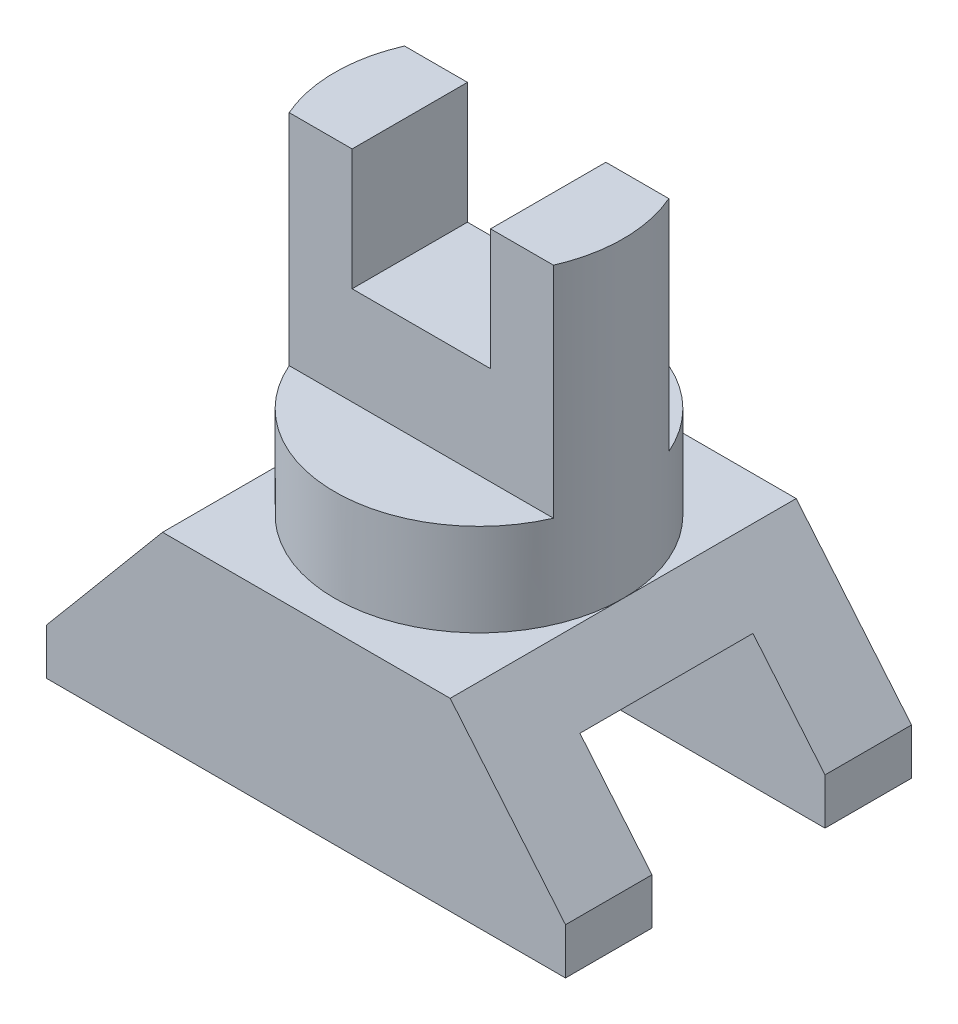
ISO-10303-21;
HEADER;
FILE_DESCRIPTION(('STEP AP214'),'2;1');
FILE_NAME('part.step','',(''),(''),'','','');
FILE_SCHEMA(('AUTOMOTIVE_DESIGN { 1 0 10303 214 1 1 1 1 }'));
ENDSEC;
DATA;
#1=APPLICATION_CONTEXT('core data for automotive mechanical design processes');
#2=APPLICATION_PROTOCOL_DEFINITION('international standard','automotive_design',2000,#1);
#3=PRODUCT_CONTEXT('',#1,'mechanical');
#4=PRODUCT('Part','Part','',(#3));
#5=PRODUCT_RELATED_PRODUCT_CATEGORY('part','',(#4));
#6=PRODUCT_DEFINITION_FORMATION('','',#4);
#7=PRODUCT_DEFINITION_CONTEXT('part definition',#1,'design');
#8=PRODUCT_DEFINITION('design','',#6,#7);
#9=PRODUCT_DEFINITION_SHAPE('','',#8);
#10=(LENGTH_UNIT() NAMED_UNIT(*) SI_UNIT(.MILLI.,.METRE.));
#11=(NAMED_UNIT(*) PLANE_ANGLE_UNIT() SI_UNIT($,.RADIAN.));
#12=(NAMED_UNIT(*) SI_UNIT($,.STERADIAN.) SOLID_ANGLE_UNIT());
#13=UNCERTAINTY_MEASURE_WITH_UNIT(LENGTH_MEASURE(1.E-05),#10,'distance_accuracy_value','');
#14=(GEOMETRIC_REPRESENTATION_CONTEXT(3) GLOBAL_UNCERTAINTY_ASSIGNED_CONTEXT((#13)) GLOBAL_UNIT_ASSIGNED_CONTEXT((#10,
#11,#12)) REPRESENTATION_CONTEXT('',''));
#15=CARTESIAN_POINT('',(0.,0.,0.));
#16=DIRECTION('',(0.,0.,1.));
#17=DIRECTION('',(1.,0.,0.));
#18=AXIS2_PLACEMENT_3D('',#15,#16,#17);
#19=CARTESIAN_POINT('',(0.,0.,0.));
#20=DIRECTION('',(0.,-1.,0.));
#21=DIRECTION('',(0.,0.,-1.));
#22=AXIS2_PLACEMENT_3D('',#19,#20,#21);
#23=PLANE('',#22);
#24=DIRECTION('',(-1.,0.,0.));
#25=VECTOR('',#24,1.);
#26=CARTESIAN_POINT('',(13.6567838997883,0.,22.4457295521094));
#27=LINE('',#26,#25);
#28=CARTESIAN_POINT('',(-6.34321610021173,0.,22.4457295521094));
#29=VERTEX_POINT('',#28);
#30=CARTESIAN_POINT('',(-56.2145518363941,0.,22.4457295521094));
#31=VERTEX_POINT('',#30);
#32=EDGE_CURVE('E182',#29,#31,#27,.T.);
#33=ORIENTED_EDGE('',*,*,#32,.F.);
#34=DIRECTION('',(0.,0.,1.));
#35=VECTOR('',#34,1.);
#36=CARTESIAN_POINT('',(-6.34321610021173,0.,-100.));
#37=LINE('',#36,#35);
#38=CARTESIAN_POINT('',(-6.34321610021173,0.,-7.55427044789058));
#39=VERTEX_POINT('',#38);
#40=EDGE_CURVE('E343',#39,#29,#37,.T.);
#41=ORIENTED_EDGE('',*,*,#40,.F.);
#42=CARTESIAN_POINT('',(-31.3432161002117,0.,-7.55427044789058));
#43=DIRECTION('',(0.,1.,0.));
#44=DIRECTION('',(0.,0.,1.));
#45=AXIS2_PLACEMENT_3D('',#42,#43,#44);
#46=CIRCLE('',#45,25.);
#47=CARTESIAN_POINT('',(-56.2145518363941,0.,-5.02115799517575));
#48=VERTEX_POINT('',#47);
#49=EDGE_CURVE('E184',#48,#39,#46,.T.);
#50=ORIENTED_EDGE('',*,*,#49,.F.);
#51=DIRECTION('',(0.,0.,1.));
#52=VECTOR('',#51,1.);
#53=CARTESIAN_POINT('',(-56.2145518363941,0.,-100.));
#54=LINE('',#53,#52);
#55=EDGE_CURVE('E178',#48,#31,#54,.T.);
#56=ORIENTED_EDGE('',*,*,#55,.T.);
#57=EDGE_LOOP('',(#33,#41,#50,#56));
#58=FACE_BOUND('',#57,.T.);
#59=ADVANCED_FACE('F33',(#58),#23,.F.);
#60=CARTESIAN_POINT('',(23.6567838997883,-9.,-22.5542704478906));
#61=DIRECTION('',(0.,-1.,0.));
#62=DIRECTION('',(0.,0.,-1.));
#63=AXIS2_PLACEMENT_3D('',#60,#61,#62);
#64=PLANE('',#63);
#65=DIRECTION('',(0.,0.,1.));
#66=VECTOR('',#65,1.);
#67=CARTESIAN_POINT('',(1.15678389978827,-9.,-22.5542704478906));
#68=LINE('',#67,#66);
#69=CARTESIAN_POINT('',(1.15678389978827,-9.,-22.5542704478906));
#70=VERTEX_POINT('',#69);
#71=CARTESIAN_POINT('',(1.15678389978827,-9.,7.44572955210943));
#72=VERTEX_POINT('',#71);
#73=EDGE_CURVE('E55',#70,#72,#68,.T.);
#74=ORIENTED_EDGE('',*,*,#73,.T.);
#75=DIRECTION('',(-1.,0.,0.));
#76=VECTOR('',#75,1.);
#77=CARTESIAN_POINT('',(23.6567838997883,-9.,7.44572955210943));
#78=LINE('',#77,#76);
#79=CARTESIAN_POINT('',(-63.7628009353257,-9.,7.44572955210943));
#80=VERTEX_POINT('',#79);
#81=EDGE_CURVE('E248',#72,#80,#78,.T.);
#82=ORIENTED_EDGE('',*,*,#81,.T.);
#83=DIRECTION('',(0.,0.,1.));
#84=VECTOR('',#83,1.);
#85=CARTESIAN_POINT('',(-63.7628009353257,-9.,-22.5542704478906));
#86=LINE('',#85,#84);
#87=CARTESIAN_POINT('',(-63.7628009353257,-9.,-22.5542704478906));
#88=VERTEX_POINT('',#87);
#89=EDGE_CURVE('E246',#88,#80,#86,.T.);
#90=ORIENTED_EDGE('',*,*,#89,.F.);
#91=DIRECTION('',(-1.,0.,0.));
#92=VECTOR('',#91,1.);
#93=CARTESIAN_POINT('',(23.6567838997883,-9.,-22.5542704478906));
#94=LINE('',#93,#92);
#95=EDGE_CURVE('E238',#70,#88,#94,.T.);
#96=ORIENTED_EDGE('',*,*,#95,.F.);
#97=EDGE_LOOP('',(#74,#82,#90,#96));
#98=FACE_BOUND('',#97,.T.);
#99=ADVANCED_FACE('F244',(#98),#64,.T.);
#100=CARTESIAN_POINT('',(-76.3432161002117,-32.,22.4457295521094));
#101=DIRECTION('',(1.,0.,0.));
#102=DIRECTION('',(0.,0.,-1.));
#103=AXIS2_PLACEMENT_3D('',#100,#101,#102);
#104=PLANE('',#103);
#105=DIRECTION('',(0.,0.,-1.));
#106=VECTOR('',#105,1.);
#107=CARTESIAN_POINT('',(-76.3432161002117,-24.,100.));
#108=LINE('',#107,#106);
#109=CARTESIAN_POINT('',(-76.3432161002117,-24.,22.4457295521094));
#110=VERTEX_POINT('',#109);
#111=CARTESIAN_POINT('',(-76.3432161002117,-24.,7.44572955210943));
#112=VERTEX_POINT('',#111);
#113=EDGE_CURVE('E195',#110,#112,#108,.T.);
#114=ORIENTED_EDGE('',*,*,#113,.T.);
#115=DIRECTION('',(0.,-1.,0.));
#116=VECTOR('',#115,1.);
#117=CARTESIAN_POINT('',(-76.3432161002117,-9.,7.44572955210943));
#118=LINE('',#117,#116);
#119=CARTESIAN_POINT('',(-76.3432161002117,-32.,7.44572955210943));
#120=VERTEX_POINT('',#119);
#121=EDGE_CURVE('E251',#112,#120,#118,.T.);
#122=ORIENTED_EDGE('',*,*,#121,.T.);
#123=DIRECTION('',(0.,0.,-1.));
#124=VECTOR('',#123,1.);
#125=CARTESIAN_POINT('',(-76.3432161002117,-32.,22.4457295521094));
#126=LINE('',#125,#124);
#127=CARTESIAN_POINT('',(-76.3432161002117,-32.,22.4457295521094));
#128=VERTEX_POINT('',#127);
#129=EDGE_CURVE('E322',#128,#120,#126,.T.);
#130=ORIENTED_EDGE('',*,*,#129,.F.);
#131=DIRECTION('',(0.,1.,0.));
#132=VECTOR('',#131,1.);
#133=CARTESIAN_POINT('',(-76.3432161002117,-32.,22.4457295521094));
#134=LINE('',#133,#132);
#135=EDGE_CURVE('E226',#128,#110,#134,.T.);
#136=ORIENTED_EDGE('',*,*,#135,.T.);
#137=EDGE_LOOP('',(#114,#122,#130,#136));
#138=FACE_BOUND('',#137,.T.);
#139=ADVANCED_FACE('F358',(#138),#104,.F.);
#140=CARTESIAN_POINT('',(13.6567838997883,-32.,22.4457295521094));
#141=DIRECTION('',(0.,0.,-1.));
#142=DIRECTION('',(-1.,0.,0.));
#143=AXIS2_PLACEMENT_3D('',#140,#141,#142);
#144=PLANE('',#143);
#145=DIRECTION('',(0.,1.,0.));
#146=VECTOR('',#145,1.);
#147=CARTESIAN_POINT('',(13.6567838997883,-32.,22.4457295521094));
#148=LINE('',#147,#146);
#149=CARTESIAN_POINT('',(13.6567838997883,-32.,22.4457295521094));
#150=VERTEX_POINT('',#149);
#151=CARTESIAN_POINT('',(13.6567838997883,-24.,22.4457295521094));
#152=VERTEX_POINT('',#151);
#153=EDGE_CURVE('E218',#150,#152,#148,.T.);
#154=ORIENTED_EDGE('',*,*,#153,.T.);
#155=DIRECTION('',(-0.64018439966448,0.768221279597376,0.));
#156=VECTOR('',#155,1.);
#157=CARTESIAN_POINT('',(17.5912101292965,-28.7213114754098,22.4457295521094));
#158=LINE('',#157,#156);
#159=EDGE_CURVE('E204',#152,#29,#158,.T.);
#160=ORIENTED_EDGE('',*,*,#159,.T.);
#161=ORIENTED_EDGE('',*,*,#32,.T.);
#162=DIRECTION('',(0.642605365190196,0.76619732747431,0.));
#163=VECTOR('',#162,1.);
#164=CARTESIAN_POINT('',(-43.1173672242365,15.6161594516141,22.4457295521094));
#165=LINE('',#164,#163);
#166=EDGE_CURVE('E192',#110,#31,#165,.T.);
#167=ORIENTED_EDGE('',*,*,#166,.F.);
#168=ORIENTED_EDGE('',*,*,#135,.F.);
#169=DIRECTION('',(-1.,0.,0.));
#170=VECTOR('',#169,1.);
#171=CARTESIAN_POINT('',(13.6567838997883,-32.,22.4457295521094));
#172=LINE('',#171,#170);
#173=EDGE_CURVE('E209',#150,#128,#172,.T.);
#174=ORIENTED_EDGE('',*,*,#173,.F.);
#175=EDGE_LOOP('',(#154,#160,#161,#167,#168,#174));
#176=FACE_BOUND('',#175,.T.);
#177=ADVANCED_FACE('F35',(#176),#144,.F.);
#178=CARTESIAN_POINT('',(23.6567838997883,-9.,7.44572955210943));
#179=DIRECTION('',(0.,0.,-1.));
#180=DIRECTION('',(-1.,0.,0.));
#181=AXIS2_PLACEMENT_3D('',#178,#179,#180);
#182=PLANE('',#181);
#183=DIRECTION('',(-0.64018439966448,0.768221279597376,0.));
#184=VECTOR('',#183,1.);
#185=CARTESIAN_POINT('',(10.3780953751981,-20.0655737704918,7.44572955210943));
#186=LINE('',#185,#184);
#187=CARTESIAN_POINT('',(13.6567838997883,-24.,7.44572955210943));
#188=VERTEX_POINT('',#187);
#189=EDGE_CURVE('E199',#188,#72,#186,.T.);
#190=ORIENTED_EDGE('',*,*,#189,.F.);
#191=DIRECTION('',(0.,-1.,0.));
#192=VECTOR('',#191,1.);
#193=CARTESIAN_POINT('',(13.6567838997883,-32.,7.44572955210943));
#194=LINE('',#193,#192);
#195=CARTESIAN_POINT('',(13.6567838997883,-32.,7.44572955210943));
#196=VERTEX_POINT('',#195);
#197=EDGE_CURVE('E247',#188,#196,#194,.T.);
#198=ORIENTED_EDGE('',*,*,#197,.T.);
#199=DIRECTION('',(1.,0.,0.));
#200=VECTOR('',#199,1.);
#201=CARTESIAN_POINT('',(0.,-32.,7.44572955210943));
#202=LINE('',#201,#200);
#203=EDGE_CURVE('E228',#120,#196,#202,.T.);
#204=ORIENTED_EDGE('',*,*,#203,.F.);
#205=ORIENTED_EDGE('',*,*,#121,.F.);
#206=DIRECTION('',(0.642605365190196,0.76619732747431,0.));
#207=VECTOR('',#206,1.);
#208=CARTESIAN_POINT('',(-27.6636128616485,34.0421265123697,7.44572955210943));
#209=LINE('',#208,#207);
#210=EDGE_CURVE('E200',#112,#80,#209,.T.);
#211=ORIENTED_EDGE('',*,*,#210,.T.);
#212=ORIENTED_EDGE('',*,*,#81,.F.);
#213=EDGE_LOOP('',(#190,#198,#204,#205,#211,#212));
#214=FACE_BOUND('',#213,.T.);
#215=ADVANCED_FACE('F362',(#214),#182,.T.);
#216=DIRECTION('',(0.,1.,0.));
#217=VECTOR('',#216,1.);
#218=CARTESIAN_POINT('',(-76.3432161002117,-32.,-22.5542704478906));
#219=LINE('',#218,#217);
#220=CARTESIAN_POINT('',(-76.3432161002117,-32.,-22.5542704478906));
#221=VERTEX_POINT('',#220);
#222=CARTESIAN_POINT('',(-76.3432161002117,-24.,-22.5542704478906));
#223=VERTEX_POINT('',#222);
#224=EDGE_CURVE('E353',#221,#223,#219,.T.);
#225=ORIENTED_EDGE('',*,*,#224,.T.);
#226=DIRECTION('',(0.,0.,1.));
#227=VECTOR('',#226,1.);
#228=CARTESIAN_POINT('',(-76.3432161002117,-24.,-100.));
#229=LINE('',#228,#227);
#230=CARTESIAN_POINT('',(-76.3432161002117,-24.,-37.5542704478906));
#231=VERTEX_POINT('',#230);
#232=EDGE_CURVE('E47',#231,#223,#229,.T.);
#233=ORIENTED_EDGE('',*,*,#232,.F.);
#234=DIRECTION('',(0.,1.,0.));
#235=VECTOR('',#234,1.);
#236=CARTESIAN_POINT('',(-76.3432161002117,-32.,-37.5542704478906));
#237=LINE('',#236,#235);
#238=CARTESIAN_POINT('',(-76.3432161002117,-32.,-37.5542704478906));
#239=VERTEX_POINT('',#238);
#240=EDGE_CURVE('E223',#239,#231,#237,.T.);
#241=ORIENTED_EDGE('',*,*,#240,.F.);
#242=EDGE_CURVE('E321',#221,#239,#126,.T.);
#243=ORIENTED_EDGE('',*,*,#242,.F.);
#244=EDGE_LOOP('',(#225,#233,#241,#243));
#245=FACE_BOUND('',#244,.T.);
#246=ADVANCED_FACE('F378',(#245),#104,.F.);
#247=CARTESIAN_POINT('',(13.6567838997883,-32.,-37.5542704478906));
#248=DIRECTION('',(-1.,0.,0.));
#249=DIRECTION('',(0.,0.,1.));
#250=AXIS2_PLACEMENT_3D('',#247,#248,#249);
#251=PLANE('',#250);
#252=DIRECTION('',(0.,0.,1.));
#253=VECTOR('',#252,1.);
#254=CARTESIAN_POINT('',(13.6567838997883,-24.,-100.));
#255=LINE('',#254,#253);
#256=CARTESIAN_POINT('',(13.6567838997883,-24.,-37.5542704478906));
#257=VERTEX_POINT('',#256);
#258=CARTESIAN_POINT('',(13.6567838997883,-24.,-22.5542704478906));
#259=VERTEX_POINT('',#258);
#260=EDGE_CURVE('E338',#257,#259,#255,.T.);
#261=ORIENTED_EDGE('',*,*,#260,.T.);
#262=DIRECTION('',(0.,1.,0.));
#263=VECTOR('',#262,1.);
#264=CARTESIAN_POINT('',(13.6567838997883,-32.,-22.5542704478906));
#265=LINE('',#264,#263);
#266=CARTESIAN_POINT('',(13.6567838997883,-32.,-22.5542704478906));
#267=VERTEX_POINT('',#266);
#268=EDGE_CURVE('E240',#267,#259,#265,.T.);
#269=ORIENTED_EDGE('',*,*,#268,.F.);
#270=DIRECTION('',(0.,0.,1.));
#271=VECTOR('',#270,1.);
#272=CARTESIAN_POINT('',(13.6567838997883,-32.,-37.5542704478906));
#273=LINE('',#272,#271);
#274=CARTESIAN_POINT('',(13.6567838997883,-32.,-37.5542704478906));
#275=VERTEX_POINT('',#274);
#276=EDGE_CURVE('E215',#275,#267,#273,.T.);
#277=ORIENTED_EDGE('',*,*,#276,.F.);
#278=DIRECTION('',(0.,1.,0.));
#279=VECTOR('',#278,1.);
#280=CARTESIAN_POINT('',(13.6567838997883,-32.,-37.5542704478906));
#281=LINE('',#280,#279);
#282=EDGE_CURVE('E220',#275,#257,#281,.T.);
#283=ORIENTED_EDGE('',*,*,#282,.T.);
#284=EDGE_LOOP('',(#261,#269,#277,#283));
#285=FACE_BOUND('',#284,.T.);
#286=ADVANCED_FACE('F337',(#285),#251,.F.);
#287=DIRECTION('',(1.,0.,0.));
#288=VECTOR('',#287,1.);
#289=CARTESIAN_POINT('',(-76.3432161002117,0.,-37.5542704478906));
#290=LINE('',#289,#288);
#291=CARTESIAN_POINT('',(-56.2145518363941,0.,-37.5542704478906));
#292=VERTEX_POINT('',#291);
#293=CARTESIAN_POINT('',(-6.34321610021173,0.,-37.5542704478906));
#294=VERTEX_POINT('',#293);
#295=EDGE_CURVE('E205',#292,#294,#290,.T.);
#296=ORIENTED_EDGE('',*,*,#295,.F.);
#297=CARTESIAN_POINT('',(-56.2145518363941,0.,-10.0873829006054));
#298=VERTEX_POINT('',#297);
#299=EDGE_CURVE('E190',#292,#298,#54,.T.);
#300=ORIENTED_EDGE('',*,*,#299,.T.);
#301=EDGE_CURVE('E302',#39,#298,#46,.T.);
#302=ORIENTED_EDGE('',*,*,#301,.F.);
#303=EDGE_CURVE('E340',#294,#39,#37,.T.);
#304=ORIENTED_EDGE('',*,*,#303,.F.);
#305=EDGE_LOOP('',(#296,#300,#302,#304));
#306=FACE_BOUND('',#305,.T.);
#307=ADVANCED_FACE('F386',(#306),#23,.F.);
#308=CARTESIAN_POINT('',(-76.3432161002117,-32.,-37.5542704478906));
#309=DIRECTION('',(0.,0.,1.));
#310=DIRECTION('',(1.,0.,0.));
#311=AXIS2_PLACEMENT_3D('',#308,#309,#310);
#312=PLANE('',#311);
#313=ORIENTED_EDGE('',*,*,#240,.T.);
#314=DIRECTION('',(0.642605365190196,0.76619732747431,0.));
#315=VECTOR('',#314,1.);
#316=CARTESIAN_POINT('',(-80.2821162076468,-28.6964667570302,-37.5542704478906));
#317=LINE('',#316,#315);
#318=EDGE_CURVE('E350',#231,#292,#317,.T.);
#319=ORIENTED_EDGE('',*,*,#318,.T.);
#320=ORIENTED_EDGE('',*,*,#295,.T.);
#321=DIRECTION('',(-0.64018439966448,0.768221279597376,0.));
#322=VECTOR('',#321,1.);
#323=CARTESIAN_POINT('',(-19.2940357723429,15.5409836065574,-37.5542704478906));
#324=LINE('',#323,#322);
#325=EDGE_CURVE('E347',#257,#294,#324,.T.);
#326=ORIENTED_EDGE('',*,*,#325,.F.);
#327=ORIENTED_EDGE('',*,*,#282,.F.);
#328=DIRECTION('',(1.,0.,0.));
#329=VECTOR('',#328,1.);
#330=CARTESIAN_POINT('',(-76.3432161002117,-32.,-37.5542704478906));
#331=LINE('',#330,#329);
#332=EDGE_CURVE('E324',#239,#275,#331,.T.);
#333=ORIENTED_EDGE('',*,*,#332,.F.);
#334=EDGE_LOOP('',(#313,#319,#320,#326,#327,#333));
#335=FACE_BOUND('',#334,.T.);
#336=ADVANCED_FACE('F381',(#335),#312,.F.);
#337=CARTESIAN_POINT('',(23.6567838997883,-32.,-22.5542704478906));
#338=DIRECTION('',(0.,0.,1.));
#339=DIRECTION('',(1.,0.,0.));
#340=AXIS2_PLACEMENT_3D('',#337,#338,#339);
#341=PLANE('',#340);
#342=DIRECTION('',(0.642605365190196,0.76619732747431,0.));
#343=VECTOR('',#342,1.);
#344=CARTESIAN_POINT('',(-38.9879506705242,20.5397845859079,-22.5542704478906));
#345=LINE('',#344,#343);
#346=EDGE_CURVE('E11',#223,#88,#345,.T.);
#347=ORIENTED_EDGE('',*,*,#346,.F.);
#348=ORIENTED_EDGE('',*,*,#224,.F.);
#349=DIRECTION('',(-1.,0.,0.));
#350=VECTOR('',#349,1.);
#351=CARTESIAN_POINT('',(0.,-32.,-22.5542704478906));
#352=LINE('',#351,#350);
#353=EDGE_CURVE('E231',#267,#221,#352,.T.);
#354=ORIENTED_EDGE('',*,*,#353,.F.);
#355=ORIENTED_EDGE('',*,*,#268,.T.);
#356=DIRECTION('',(-0.64018439966448,0.768221279597376,0.));
#357=VECTOR('',#356,1.);
#358=CARTESIAN_POINT('',(21.6895707850342,-33.6393442622951,-22.5542704478906));
#359=LINE('',#358,#357);
#360=EDGE_CURVE('E41',#259,#70,#359,.T.);
#361=ORIENTED_EDGE('',*,*,#360,.T.);
#362=ORIENTED_EDGE('',*,*,#95,.T.);
#363=EDGE_LOOP('',(#347,#348,#354,#355,#361,#362));
#364=FACE_BOUND('',#363,.T.);
#365=ADVANCED_FACE('F237',(#364),#341,.T.);
#366=ORIENTED_EDGE('',*,*,#197,.F.);
#367=DIRECTION('',(0.,0.,-1.));
#368=VECTOR('',#367,1.);
#369=CARTESIAN_POINT('',(13.6567838997883,-24.,100.));
#370=LINE('',#369,#368);
#371=EDGE_CURVE('E369',#152,#188,#370,.T.);
#372=ORIENTED_EDGE('',*,*,#371,.F.);
#373=ORIENTED_EDGE('',*,*,#153,.F.);
#374=EDGE_CURVE('E325',#196,#150,#273,.T.);
#375=ORIENTED_EDGE('',*,*,#374,.F.);
#376=EDGE_LOOP('',(#366,#372,#373,#375));
#377=FACE_BOUND('',#376,.T.);
#378=ADVANCED_FACE('F368',(#377),#251,.F.);
#379=CARTESIAN_POINT('',(0.,-32.,0.));
#380=DIRECTION('',(0.,-1.,0.));
#381=DIRECTION('',(0.,0.,-1.));
#382=AXIS2_PLACEMENT_3D('',#379,#380,#381);
#383=PLANE('',#382);
#384=ORIENTED_EDGE('',*,*,#276,.T.);
#385=ORIENTED_EDGE('',*,*,#353,.T.);
#386=ORIENTED_EDGE('',*,*,#242,.T.);
#387=ORIENTED_EDGE('',*,*,#332,.T.);
#388=EDGE_LOOP('',(#384,#385,#386,#387));
#389=FACE_BOUND('',#388,.T.);
#390=ADVANCED_FACE('F334',(#389),#383,.T.);
#391=ORIENTED_EDGE('',*,*,#129,.T.);
#392=ORIENTED_EDGE('',*,*,#203,.T.);
#393=ORIENTED_EDGE('',*,*,#374,.T.);
#394=ORIENTED_EDGE('',*,*,#173,.T.);
#395=EDGE_LOOP('',(#391,#392,#393,#394));
#396=FACE_BOUND('',#395,.T.);
#397=ADVANCED_FACE('F364',(#396),#383,.T.);
#398=CARTESIAN_POINT('',(0.,54.,-17.5542704478906));
#399=DIRECTION('',(0.,0.,1.));
#400=DIRECTION('',(1.,0.,0.));
#401=AXIS2_PLACEMENT_3D('',#398,#399,#400);
#402=PLANE('',#401);
#403=DIRECTION('',(0.,-1.,0.));
#404=VECTOR('',#403,1.);
#405=CARTESIAN_POINT('',(-8.43033762543253,54.,-17.5542704478906));
#406=LINE('',#405,#404);
#407=CARTESIAN_POINT('',(-8.43033762543253,54.,-17.5542704478906));
#408=VERTEX_POINT('',#407);
#409=CARTESIAN_POINT('',(-8.43033762543253,16.,-17.5542704478906));
#410=VERTEX_POINT('',#409);
#411=EDGE_CURVE('E293',#408,#410,#406,.T.);
#412=ORIENTED_EDGE('',*,*,#411,.T.);
#413=DIRECTION('',(-1.,0.,0.));
#414=VECTOR('',#413,1.);
#415=CARTESIAN_POINT('',(0.,16.,-17.5542704478906));
#416=LINE('',#415,#414);
#417=CARTESIAN_POINT('',(-54.2560945749909,16.,-17.5542704478906));
#418=VERTEX_POINT('',#417);
#419=EDGE_CURVE('E256',#410,#418,#416,.T.);
#420=ORIENTED_EDGE('',*,*,#419,.T.);
#421=DIRECTION('',(0.,-1.,0.));
#422=VECTOR('',#421,1.);
#423=CARTESIAN_POINT('',(-54.2560945749909,54.,-17.5542704478906));
#424=LINE('',#423,#422);
#425=CARTESIAN_POINT('',(-54.2560945749909,54.,-17.5542704478906));
#426=VERTEX_POINT('',#425);
#427=EDGE_CURVE('E206',#426,#418,#424,.T.);
#428=ORIENTED_EDGE('',*,*,#427,.F.);
#429=DIRECTION('',(-1.,0.,0.));
#430=VECTOR('',#429,1.);
#431=CARTESIAN_POINT('',(0.,54.,-17.5542704478906));
#432=LINE('',#431,#430);
#433=CARTESIAN_POINT('',(-43.3432161002117,54.,-17.5542704478906));
#434=VERTEX_POINT('',#433);
#435=EDGE_CURVE('E298',#434,#426,#432,.T.);
#436=ORIENTED_EDGE('',*,*,#435,.F.);
#437=DIRECTION('',(0.,-1.,0.));
#438=VECTOR('',#437,1.);
#439=CARTESIAN_POINT('',(-43.3432161002117,54.,-17.5542704478906));
#440=LINE('',#439,#438);
#441=CARTESIAN_POINT('',(-43.3432161002117,33.,-17.5542704478906));
#442=VERTEX_POINT('',#441);
#443=EDGE_CURVE('E309',#434,#442,#440,.T.);
#444=ORIENTED_EDGE('',*,*,#443,.T.);
#445=DIRECTION('',(-1.,0.,0.));
#446=VECTOR('',#445,1.);
#447=CARTESIAN_POINT('',(0.,33.,-17.5542704478906));
#448=LINE('',#447,#446);
#449=CARTESIAN_POINT('',(-19.3432161002117,33.,-17.5542704478906));
#450=VERTEX_POINT('',#449);
#451=EDGE_CURVE('E272',#450,#442,#448,.T.);
#452=ORIENTED_EDGE('',*,*,#451,.F.);
#453=DIRECTION('',(0.,-1.,0.));
#454=VECTOR('',#453,1.);
#455=CARTESIAN_POINT('',(-19.3432161002117,54.,-17.5542704478906));
#456=LINE('',#455,#454);
#457=CARTESIAN_POINT('',(-19.3432161002117,54.,-17.5542704478906));
#458=VERTEX_POINT('',#457);
#459=EDGE_CURVE('E291',#458,#450,#456,.T.);
#460=ORIENTED_EDGE('',*,*,#459,.F.);
#461=DIRECTION('',(-1.,0.,0.));
#462=VECTOR('',#461,1.);
#463=CARTESIAN_POINT('',(0.,54.,-17.5542704478906));
#464=LINE('',#463,#462);
#465=EDGE_CURVE('E283',#408,#458,#464,.T.);
#466=ORIENTED_EDGE('',*,*,#465,.F.);
#467=EDGE_LOOP('',(#412,#420,#428,#436,#444,#452,#460,#466));
#468=FACE_BOUND('',#467,.T.);
#469=ADVANCED_FACE('F462',(#468),#402,.F.);
#470=CARTESIAN_POINT('',(-31.3432161002117,54.,-7.55427044789058));
#471=DIRECTION('',(0.,-1.,0.));
#472=DIRECTION('',(0.,0.,-1.));
#473=AXIS2_PLACEMENT_3D('',#470,#471,#472);
#474=CYLINDRICAL_SURFACE('',#473,25.);
#475=ORIENTED_EDGE('',*,*,#301,.T.);
#476=EDGE_CURVE('E312',#298,#48,#46,.T.);
#477=ORIENTED_EDGE('',*,*,#476,.T.);
#478=ORIENTED_EDGE('',*,*,#49,.T.);
#479=EDGE_LOOP('',(#475,#477,#478));
#480=FACE_BOUND('',#479,.T.);
#481=ORIENTED_EDGE('',*,*,#427,.T.);
#482=CARTESIAN_POINT('',(-31.3432161002117,16.,-7.55427044789058));
#483=DIRECTION('',(0.,1.,0.));
#484=DIRECTION('',(0.,0.,1.));
#485=AXIS2_PLACEMENT_3D('',#482,#483,#484);
#486=CIRCLE('',#485,25.);
#487=EDGE_CURVE('E258',#410,#418,#486,.T.);
#488=ORIENTED_EDGE('',*,*,#487,.F.);
#489=ORIENTED_EDGE('',*,*,#411,.F.);
#490=CARTESIAN_POINT('',(-31.3432161002117,54.,-7.55427044789058));
#491=DIRECTION('',(0.,1.,0.));
#492=DIRECTION('',(0.,0.,1.));
#493=AXIS2_PLACEMENT_3D('',#490,#491,#492);
#494=CIRCLE('',#493,25.);
#495=CARTESIAN_POINT('',(-8.43033762543253,54.,2.44572955210943));
#496=VERTEX_POINT('',#495);
#497=EDGE_CURVE('E281',#496,#408,#494,.T.);
#498=ORIENTED_EDGE('',*,*,#497,.F.);
#499=DIRECTION('',(0.,-1.,0.));
#500=VECTOR('',#499,1.);
#501=CARTESIAN_POINT('',(-8.43033762543253,54.,2.44572955210943));
#502=LINE('',#501,#500);
#503=CARTESIAN_POINT('',(-8.43033762543253,16.,2.44572955210943));
#504=VERTEX_POINT('',#503);
#505=EDGE_CURVE('E295',#496,#504,#502,.T.);
#506=ORIENTED_EDGE('',*,*,#505,.T.);
#507=CARTESIAN_POINT('',(-31.3432161002117,16.,-7.55427044789058));
#508=DIRECTION('',(0.,1.,0.));
#509=DIRECTION('',(0.,0.,1.));
#510=AXIS2_PLACEMENT_3D('',#507,#508,#509);
#511=CIRCLE('',#510,25.);
#512=CARTESIAN_POINT('',(-54.2560945749909,16.,2.44572955210943));
#513=VERTEX_POINT('',#512);
#514=EDGE_CURVE('E264',#513,#504,#511,.T.);
#515=ORIENTED_EDGE('',*,*,#514,.F.);
#516=DIRECTION('',(0.,-1.,0.));
#517=VECTOR('',#516,1.);
#518=CARTESIAN_POINT('',(-54.2560945749909,54.,2.44572955210943));
#519=LINE('',#518,#517);
#520=CARTESIAN_POINT('',(-54.2560945749909,54.,2.44572955210943));
#521=VERTEX_POINT('',#520);
#522=EDGE_CURVE('E212',#521,#513,#519,.T.);
#523=ORIENTED_EDGE('',*,*,#522,.F.);
#524=CARTESIAN_POINT('',(-31.3432161002117,54.,-7.55427044789058));
#525=DIRECTION('',(0.,1.,0.));
#526=DIRECTION('',(0.,0.,1.));
#527=AXIS2_PLACEMENT_3D('',#524,#525,#526);
#528=CIRCLE('',#527,25.);
#529=EDGE_CURVE('E301',#426,#521,#528,.T.);
#530=ORIENTED_EDGE('',*,*,#529,.F.);
#531=EDGE_LOOP('',(#481,#488,#489,#498,#506,#515,#523,#530));
#532=FACE_BOUND('',#531,.T.);
#533=ADVANCED_FACE('F389',(#480,#532),#474,.T.);
#534=CARTESIAN_POINT('',(0.,54.,2.44572955210942));
#535=DIRECTION('',(0.,0.,-1.));
#536=DIRECTION('',(-1.,0.,0.));
#537=AXIS2_PLACEMENT_3D('',#534,#535,#536);
#538=PLANE('',#537);
#539=ORIENTED_EDGE('',*,*,#522,.T.);
#540=DIRECTION('',(1.,0.,0.));
#541=VECTOR('',#540,1.);
#542=CARTESIAN_POINT('',(0.,16.,2.44572955210942));
#543=LINE('',#542,#541);
#544=EDGE_CURVE('E261',#513,#504,#543,.T.);
#545=ORIENTED_EDGE('',*,*,#544,.T.);
#546=ORIENTED_EDGE('',*,*,#505,.F.);
#547=DIRECTION('',(1.,0.,0.));
#548=VECTOR('',#547,1.);
#549=CARTESIAN_POINT('',(0.,54.,2.44572955210942));
#550=LINE('',#549,#548);
#551=CARTESIAN_POINT('',(-19.3432161002117,54.,2.44572955210943));
#552=VERTEX_POINT('',#551);
#553=EDGE_CURVE('E278',#552,#496,#550,.T.);
#554=ORIENTED_EDGE('',*,*,#553,.F.);
#555=DIRECTION('',(0.,-1.,0.));
#556=VECTOR('',#555,1.);
#557=CARTESIAN_POINT('',(-19.3432161002117,54.,2.44572955210943));
#558=LINE('',#557,#556);
#559=CARTESIAN_POINT('',(-19.3432161002117,33.,2.44572955210943));
#560=VERTEX_POINT('',#559);
#561=EDGE_CURVE('E288',#552,#560,#558,.T.);
#562=ORIENTED_EDGE('',*,*,#561,.T.);
#563=DIRECTION('',(1.,0.,0.));
#564=VECTOR('',#563,1.);
#565=CARTESIAN_POINT('',(0.,33.,2.44572955210942));
#566=LINE('',#565,#564);
#567=CARTESIAN_POINT('',(-43.3432161002117,33.,2.44572955210943));
#568=VERTEX_POINT('',#567);
#569=EDGE_CURVE('E266',#568,#560,#566,.T.);
#570=ORIENTED_EDGE('',*,*,#569,.F.);
#571=DIRECTION('',(0.,-1.,0.));
#572=VECTOR('',#571,1.);
#573=CARTESIAN_POINT('',(-43.3432161002117,54.,2.44572955210943));
#574=LINE('',#573,#572);
#575=CARTESIAN_POINT('',(-43.3432161002117,54.,2.44572955210943));
#576=VERTEX_POINT('',#575);
#577=EDGE_CURVE('E315',#576,#568,#574,.T.);
#578=ORIENTED_EDGE('',*,*,#577,.F.);
#579=DIRECTION('',(1.,0.,0.));
#580=VECTOR('',#579,1.);
#581=CARTESIAN_POINT('',(0.,54.,2.44572955210942));
#582=LINE('',#581,#580);
#583=EDGE_CURVE('E304',#521,#576,#582,.T.);
#584=ORIENTED_EDGE('',*,*,#583,.F.);
#585=EDGE_LOOP('',(#539,#545,#546,#554,#562,#570,#578,#584));
#586=FACE_BOUND('',#585,.T.);
#587=ADVANCED_FACE('F455',(#586),#538,.F.);
#588=CARTESIAN_POINT('',(-43.3432161002117,54.,0.));
#589=DIRECTION('',(1.,0.,0.));
#590=DIRECTION('',(0.,0.,-1.));
#591=AXIS2_PLACEMENT_3D('',#588,#589,#590);
#592=PLANE('',#591);
#593=DIRECTION('',(0.,0.,1.));
#594=VECTOR('',#593,1.);
#595=CARTESIAN_POINT('',(-43.3432161002117,33.,0.));
#596=LINE('',#595,#594);
#597=EDGE_CURVE('E275',#442,#568,#596,.T.);
#598=ORIENTED_EDGE('',*,*,#597,.F.);
#599=ORIENTED_EDGE('',*,*,#443,.F.);
#600=DIRECTION('',(0.,0.,1.));
#601=VECTOR('',#600,1.);
#602=CARTESIAN_POINT('',(-43.3432161002117,54.,0.));
#603=LINE('',#602,#601);
#604=EDGE_CURVE('E306',#434,#576,#603,.T.);
#605=ORIENTED_EDGE('',*,*,#604,.T.);
#606=ORIENTED_EDGE('',*,*,#577,.T.);
#607=EDGE_LOOP('',(#598,#599,#605,#606));
#608=FACE_BOUND('',#607,.T.);
#609=ADVANCED_FACE('F451',(#608),#592,.T.);
#610=CARTESIAN_POINT('',(0.,54.,0.));
#611=DIRECTION('',(0.,1.,0.));
#612=DIRECTION('',(0.,0.,1.));
#613=AXIS2_PLACEMENT_3D('',#610,#611,#612);
#614=PLANE('',#613);
#615=ORIENTED_EDGE('',*,*,#435,.T.);
#616=ORIENTED_EDGE('',*,*,#529,.T.);
#617=ORIENTED_EDGE('',*,*,#583,.T.);
#618=ORIENTED_EDGE('',*,*,#604,.F.);
#619=EDGE_LOOP('',(#615,#616,#617,#618));
#620=FACE_BOUND('',#619,.T.);
#621=ADVANCED_FACE('F447',(#620),#614,.T.);
#622=CARTESIAN_POINT('',(-19.3432161002117,54.,0.));
#623=DIRECTION('',(-1.,0.,0.));
#624=DIRECTION('',(0.,0.,1.));
#625=AXIS2_PLACEMENT_3D('',#622,#623,#624);
#626=PLANE('',#625);
#627=DIRECTION('',(0.,0.,-1.));
#628=VECTOR('',#627,1.);
#629=CARTESIAN_POINT('',(-19.3432161002117,33.,0.));
#630=LINE('',#629,#628);
#631=EDGE_CURVE('E269',#560,#450,#630,.T.);
#632=ORIENTED_EDGE('',*,*,#631,.F.);
#633=ORIENTED_EDGE('',*,*,#561,.F.);
#634=DIRECTION('',(0.,0.,-1.));
#635=VECTOR('',#634,1.);
#636=CARTESIAN_POINT('',(-19.3432161002117,54.,0.));
#637=LINE('',#636,#635);
#638=EDGE_CURVE('E285',#552,#458,#637,.T.);
#639=ORIENTED_EDGE('',*,*,#638,.T.);
#640=ORIENTED_EDGE('',*,*,#459,.T.);
#641=EDGE_LOOP('',(#632,#633,#639,#640));
#642=FACE_BOUND('',#641,.T.);
#643=ADVANCED_FACE('F443',(#642),#626,.T.);
#644=CARTESIAN_POINT('',(0.,54.,0.));
#645=DIRECTION('',(0.,1.,0.));
#646=DIRECTION('',(0.,0.,1.));
#647=AXIS2_PLACEMENT_3D('',#644,#645,#646);
#648=PLANE('',#647);
#649=ORIENTED_EDGE('',*,*,#553,.T.);
#650=ORIENTED_EDGE('',*,*,#497,.T.);
#651=ORIENTED_EDGE('',*,*,#465,.T.);
#652=ORIENTED_EDGE('',*,*,#638,.F.);
#653=EDGE_LOOP('',(#649,#650,#651,#652));
#654=FACE_BOUND('',#653,.T.);
#655=ADVANCED_FACE('F439',(#654),#648,.T.);
#656=CARTESIAN_POINT('',(0.,33.,0.));
#657=DIRECTION('',(0.,1.,0.));
#658=DIRECTION('',(0.,0.,1.));
#659=AXIS2_PLACEMENT_3D('',#656,#657,#658);
#660=PLANE('',#659);
#661=ORIENTED_EDGE('',*,*,#569,.T.);
#662=ORIENTED_EDGE('',*,*,#631,.T.);
#663=ORIENTED_EDGE('',*,*,#451,.T.);
#664=ORIENTED_EDGE('',*,*,#597,.T.);
#665=EDGE_LOOP('',(#661,#662,#663,#664));
#666=FACE_BOUND('',#665,.T.);
#667=ADVANCED_FACE('F435',(#666),#660,.T.);
#668=CARTESIAN_POINT('',(0.,16.,0.));
#669=DIRECTION('',(0.,1.,0.));
#670=DIRECTION('',(0.,0.,1.));
#671=AXIS2_PLACEMENT_3D('',#668,#669,#670);
#672=PLANE('',#671);
#673=ORIENTED_EDGE('',*,*,#544,.F.);
#674=ORIENTED_EDGE('',*,*,#514,.T.);
#675=EDGE_LOOP('',(#673,#674));
#676=FACE_BOUND('',#675,.T.);
#677=ADVANCED_FACE('F431',(#676),#672,.T.);
#678=CARTESIAN_POINT('',(0.,16.,0.));
#679=DIRECTION('',(0.,1.,0.));
#680=DIRECTION('',(0.,0.,1.));
#681=AXIS2_PLACEMENT_3D('',#678,#679,#680);
#682=PLANE('',#681);
#683=ORIENTED_EDGE('',*,*,#419,.F.);
#684=ORIENTED_EDGE('',*,*,#487,.T.);
#685=EDGE_LOOP('',(#683,#684));
#686=FACE_BOUND('',#685,.T.);
#687=ADVANCED_FACE('F400',(#686),#682,.T.);
#688=CARTESIAN_POINT('',(-3.74353737061676,-3.11961447551397,-100.));
#689=DIRECTION('',(0.768221279597376,0.64018439966448,0.));
#690=DIRECTION('',(-0.64018439966448,0.768221279597376,0.));
#691=AXIS2_PLACEMENT_3D('',#688,#689,#690);
#692=PLANE('',#691);
#693=ORIENTED_EDGE('',*,*,#325,.T.);
#694=ORIENTED_EDGE('',*,*,#303,.T.);
#695=ORIENTED_EDGE('',*,*,#40,.T.);
#696=ORIENTED_EDGE('',*,*,#159,.F.);
#697=ORIENTED_EDGE('',*,*,#371,.T.);
#698=ORIENTED_EDGE('',*,*,#189,.T.);
#699=ORIENTED_EDGE('',*,*,#73,.F.);
#700=ORIENTED_EDGE('',*,*,#360,.F.);
#701=ORIENTED_EDGE('',*,*,#260,.F.);
#702=EDGE_LOOP('',(#693,#694,#695,#696,#697,#698,#699,#700,#701));
#703=FACE_BOUND('',#702,.T.);
#704=ADVANCED_FACE('F376',(#703),#692,.T.);
#705=CARTESIAN_POINT('',(0.,0.,-100.));
#706=DIRECTION('',(0.,1.,0.));
#707=DIRECTION('',(0.,0.,1.));
#708=AXIS2_PLACEMENT_3D('',#705,#706,#707);
#709=PLANE('',#708);
#710=EDGE_CURVE('E188',#298,#48,#54,.T.);
#711=ORIENTED_EDGE('',*,*,#710,.T.);
#712=ORIENTED_EDGE('',*,*,#476,.F.);
#713=EDGE_LOOP('',(#711,#712));
#714=FACE_BOUND('',#713,.T.);
#715=ADVANCED_FACE('F392',(#714),#709,.F.);
#716=CARTESIAN_POINT('',(-33.0012217451219,27.6779380334732,-100.));
#717=DIRECTION('',(0.76619732747431,-0.642605365190196,0.));
#718=DIRECTION('',(0.642605365190196,0.76619732747431,0.));
#719=AXIS2_PLACEMENT_3D('',#716,#717,#718);
#720=PLANE('',#719);
#721=ORIENTED_EDGE('',*,*,#232,.T.);
#722=ORIENTED_EDGE('',*,*,#346,.T.);
#723=ORIENTED_EDGE('',*,*,#89,.T.);
#724=ORIENTED_EDGE('',*,*,#210,.F.);
#725=ORIENTED_EDGE('',*,*,#113,.F.);
#726=ORIENTED_EDGE('',*,*,#166,.T.);
#727=ORIENTED_EDGE('',*,*,#55,.F.);
#728=ORIENTED_EDGE('',*,*,#710,.F.);
#729=ORIENTED_EDGE('',*,*,#299,.F.);
#730=ORIENTED_EDGE('',*,*,#318,.F.);
#731=EDGE_LOOP('',(#721,#722,#723,#724,#725,#726,#727,#728,#729,#730));
#732=FACE_BOUND('',#731,.T.);
#733=ADVANCED_FACE('F193',(#732),#720,.F.);
#734=CLOSED_SHELL('',(#59,#99,#139,#177,#215,#246,#286,#307,#336,#365,#378,#390,#397,#469,#533,
#587,#609,#621,#643,#655,#667,#677,#687,#704,#715,#733));
#735=MANIFOLD_SOLID_BREP('B2',#734);
#736=ADVANCED_BREP_SHAPE_REPRESENTATION('',(#18,#735),#14);
#737=SHAPE_DEFINITION_REPRESENTATION(#9,#736);
ENDSEC;
END-ISO-10303-21;
